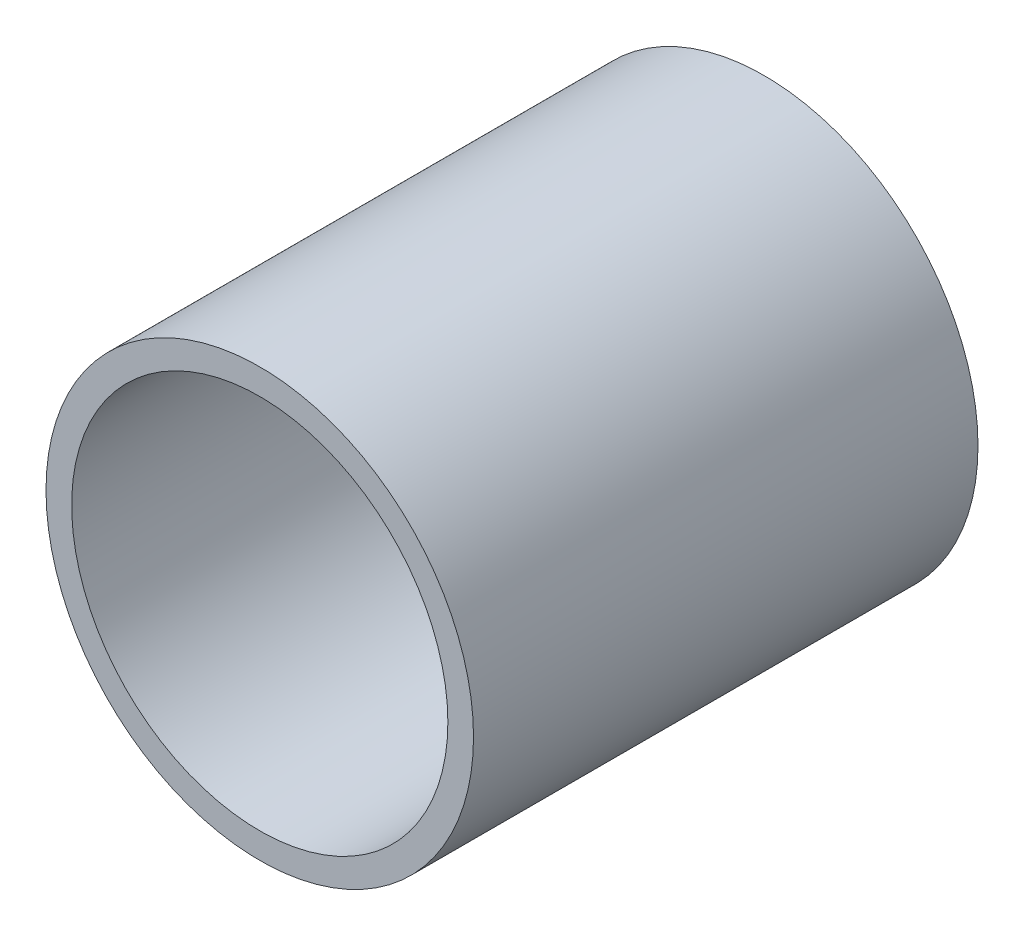
ISO-10303-21;
HEADER;
FILE_DESCRIPTION(('STEP AP214'),'2;1');
FILE_NAME('part.step','',(''),(''),'','','');
FILE_SCHEMA(('AUTOMOTIVE_DESIGN { 1 0 10303 214 1 1 1 1 }'));
ENDSEC;
DATA;
#1=APPLICATION_CONTEXT('core data for automotive mechanical design processes');
#2=APPLICATION_PROTOCOL_DEFINITION('international standard','automotive_design',2000,#1);
#3=PRODUCT_CONTEXT('',#1,'mechanical');
#4=PRODUCT('Part','Part','',(#3));
#5=PRODUCT_RELATED_PRODUCT_CATEGORY('part','',(#4));
#6=PRODUCT_DEFINITION_FORMATION('','',#4);
#7=PRODUCT_DEFINITION_CONTEXT('part definition',#1,'design');
#8=PRODUCT_DEFINITION('design','',#6,#7);
#9=PRODUCT_DEFINITION_SHAPE('','',#8);
#10=(LENGTH_UNIT() NAMED_UNIT(*) SI_UNIT(.MILLI.,.METRE.));
#11=(NAMED_UNIT(*) PLANE_ANGLE_UNIT() SI_UNIT($,.RADIAN.));
#12=(NAMED_UNIT(*) SI_UNIT($,.STERADIAN.) SOLID_ANGLE_UNIT());
#13=UNCERTAINTY_MEASURE_WITH_UNIT(LENGTH_MEASURE(1.E-05),#10,'distance_accuracy_value','');
#14=(GEOMETRIC_REPRESENTATION_CONTEXT(3) GLOBAL_UNCERTAINTY_ASSIGNED_CONTEXT((#13)) GLOBAL_UNIT_ASSIGNED_CONTEXT((#10,
#11,#12)) REPRESENTATION_CONTEXT('',''));
#15=CARTESIAN_POINT('',(0.,0.,0.));
#16=DIRECTION('',(0.,0.,1.));
#17=DIRECTION('',(1.,0.,0.));
#18=AXIS2_PLACEMENT_3D('',#15,#16,#17);
#19=CARTESIAN_POINT('',(0.,0.,14.986));
#20=DIRECTION('',(0.,0.,1.));
#21=DIRECTION('',(1.,0.,0.));
#22=AXIS2_PLACEMENT_3D('',#19,#20,#21);
#23=CYLINDRICAL_SURFACE('',#22,5.588);
#24=CARTESIAN_POINT('',(0.,0.,0.));
#25=DIRECTION('',(0.,0.,1.));
#26=DIRECTION('',(1.,0.,0.));
#27=AXIS2_PLACEMENT_3D('',#24,#25,#26);
#28=CIRCLE('',#27,5.588);
#29=CARTESIAN_POINT('',(5.58800000000001,0.,0.));
#30=VERTEX_POINT('',#29);
#31=EDGE_CURVE('E27',#30,#30,#28,.T.);
#32=ORIENTED_EDGE('',*,*,#31,.F.);
#33=EDGE_LOOP('',(#32));
#34=FACE_BOUND('',#33,.T.);
#35=CARTESIAN_POINT('',(0.,0.,14.986));
#36=DIRECTION('',(0.,0.,1.));
#37=DIRECTION('',(1.,0.,0.));
#38=AXIS2_PLACEMENT_3D('',#35,#36,#37);
#39=CIRCLE('',#38,5.588);
#40=CARTESIAN_POINT('',(5.58800000000001,0.,14.986));
#41=VERTEX_POINT('',#40);
#42=EDGE_CURVE('E18',#41,#41,#39,.T.);
#43=ORIENTED_EDGE('',*,*,#42,.T.);
#44=EDGE_LOOP('',(#43));
#45=FACE_BOUND('',#44,.T.);
#46=ADVANCED_FACE('F15',(#34,#45),#23,.F.);
#47=CARTESIAN_POINT('',(0.,0.,14.986));
#48=DIRECTION('',(0.,0.,-1.));
#49=DIRECTION('',(-1.,0.,0.));
#50=AXIS2_PLACEMENT_3D('',#47,#48,#49);
#51=PLANE('',#50);
#52=CARTESIAN_POINT('',(0.,0.,14.986));
#53=DIRECTION('',(0.,0.,1.));
#54=DIRECTION('',(1.,0.,0.));
#55=AXIS2_PLACEMENT_3D('',#52,#53,#54);
#56=CIRCLE('',#55,6.35);
#57=CARTESIAN_POINT('',(6.35,0.,14.986));
#58=VERTEX_POINT('',#57);
#59=EDGE_CURVE('E22',#58,#58,#56,.F.);
#60=ORIENTED_EDGE('',*,*,#59,.F.);
#61=EDGE_LOOP('',(#60));
#62=FACE_BOUND('',#61,.T.);
#63=ORIENTED_EDGE('',*,*,#42,.F.);
#64=EDGE_LOOP('',(#63));
#65=FACE_BOUND('',#64,.T.);
#66=ADVANCED_FACE('F36',(#62,#65),#51,.F.);
#67=CARTESIAN_POINT('',(0.,0.,0.));
#68=DIRECTION('',(0.,0.,-1.));
#69=DIRECTION('',(-1.,0.,0.));
#70=AXIS2_PLACEMENT_3D('',#67,#68,#69);
#71=PLANE('',#70);
#72=CARTESIAN_POINT('',(0.,0.,0.));
#73=DIRECTION('',(0.,0.,1.));
#74=DIRECTION('',(1.,0.,0.));
#75=AXIS2_PLACEMENT_3D('',#72,#73,#74);
#76=CIRCLE('',#75,6.35);
#77=CARTESIAN_POINT('',(6.35,0.,0.));
#78=VERTEX_POINT('',#77);
#79=EDGE_CURVE('E10',#78,#78,#76,.T.);
#80=ORIENTED_EDGE('',*,*,#79,.F.);
#81=EDGE_LOOP('',(#80));
#82=FACE_BOUND('',#81,.T.);
#83=ORIENTED_EDGE('',*,*,#31,.T.);
#84=EDGE_LOOP('',(#83));
#85=FACE_BOUND('',#84,.T.);
#86=ADVANCED_FACE('F38',(#82,#85),#71,.T.);
#87=CARTESIAN_POINT('',(0.,0.,14.986));
#88=DIRECTION('',(0.,0.,1.));
#89=DIRECTION('',(1.,0.,0.));
#90=AXIS2_PLACEMENT_3D('',#87,#88,#89);
#91=CYLINDRICAL_SURFACE('',#90,6.35);
#92=ORIENTED_EDGE('',*,*,#79,.T.);
#93=EDGE_LOOP('',(#92));
#94=FACE_BOUND('',#93,.T.);
#95=ORIENTED_EDGE('',*,*,#59,.T.);
#96=EDGE_LOOP('',(#95));
#97=FACE_BOUND('',#96,.T.);
#98=ADVANCED_FACE('F45',(#94,#97),#91,.T.);
#99=CLOSED_SHELL('',(#46,#66,#86,#98));
#100=MANIFOLD_SOLID_BREP('B1',#99);
#101=ADVANCED_BREP_SHAPE_REPRESENTATION('',(#18,#100),#14);
#102=SHAPE_DEFINITION_REPRESENTATION(#9,#101);
ENDSEC;
END-ISO-10303-21;
